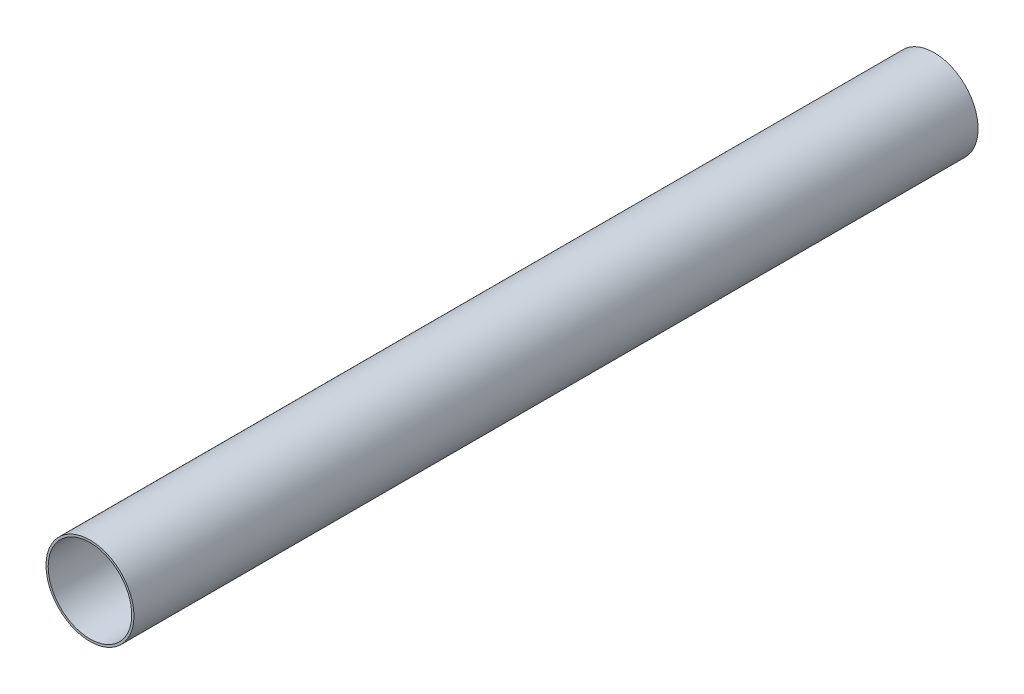
ISO-10303-21;
HEADER;
FILE_DESCRIPTION(('STEP AP214'),'2;1');
FILE_NAME('part.step','',(''),(''),'','','');
FILE_SCHEMA(('AUTOMOTIVE_DESIGN { 1 0 10303 214 1 1 1 1 }'));
ENDSEC;
DATA;
#1=APPLICATION_CONTEXT('core data for automotive mechanical design processes');
#2=APPLICATION_PROTOCOL_DEFINITION('international standard','automotive_design',2000,#1);
#3=PRODUCT_CONTEXT('',#1,'mechanical');
#4=PRODUCT('Part','Part','',(#3));
#5=PRODUCT_RELATED_PRODUCT_CATEGORY('part','',(#4));
#6=PRODUCT_DEFINITION_FORMATION('','',#4);
#7=PRODUCT_DEFINITION_CONTEXT('part definition',#1,'design');
#8=PRODUCT_DEFINITION('design','',#6,#7);
#9=PRODUCT_DEFINITION_SHAPE('','',#8);
#10=(LENGTH_UNIT() NAMED_UNIT(*) SI_UNIT(.MILLI.,.METRE.));
#11=(NAMED_UNIT(*) PLANE_ANGLE_UNIT() SI_UNIT($,.RADIAN.));
#12=(NAMED_UNIT(*) SI_UNIT($,.STERADIAN.) SOLID_ANGLE_UNIT());
#13=UNCERTAINTY_MEASURE_WITH_UNIT(LENGTH_MEASURE(1.E-05),#10,'distance_accuracy_value','');
#14=(GEOMETRIC_REPRESENTATION_CONTEXT(3) GLOBAL_UNCERTAINTY_ASSIGNED_CONTEXT((#13)) GLOBAL_UNIT_ASSIGNED_CONTEXT((#10,
#11,#12)) REPRESENTATION_CONTEXT('',''));
#15=CARTESIAN_POINT('',(0.,0.,0.));
#16=DIRECTION('',(0.,0.,1.));
#17=DIRECTION('',(1.,0.,0.));
#18=AXIS2_PLACEMENT_3D('',#15,#16,#17);
#19=CARTESIAN_POINT('',(0.,0.,609.6));
#20=DIRECTION('',(0.,0.,1.));
#21=DIRECTION('',(1.,0.,0.));
#22=AXIS2_PLACEMENT_3D('',#19,#20,#21);
#23=PLANE('',#22);
#24=CARTESIAN_POINT('',(0.,0.,609.6));
#25=DIRECTION('',(0.,0.,1.));
#26=DIRECTION('',(1.,0.,0.));
#27=AXIS2_PLACEMENT_3D('',#24,#25,#26);
#28=CIRCLE('',#27,31.75);
#29=CARTESIAN_POINT('',(-31.75,0.,609.6));
#30=VERTEX_POINT('',#29);
#31=EDGE_CURVE('E10',#30,#30,#28,.T.);
#32=ORIENTED_EDGE('',*,*,#31,.T.);
#33=EDGE_LOOP('',(#32));
#34=FACE_BOUND('',#33,.T.);
#35=CARTESIAN_POINT('',(0.,0.,609.6));
#36=DIRECTION('',(0.,0.,1.));
#37=DIRECTION('',(1.,0.,0.));
#38=AXIS2_PLACEMENT_3D('',#35,#36,#37);
#39=CIRCLE('',#38,30.1625);
#40=CARTESIAN_POINT('',(-30.1625,0.,609.6));
#41=VERTEX_POINT('',#40);
#42=EDGE_CURVE('E44',#41,#41,#39,.T.);
#43=ORIENTED_EDGE('',*,*,#42,.F.);
#44=EDGE_LOOP('',(#43));
#45=FACE_BOUND('',#44,.T.);
#46=ADVANCED_FACE('F33',(#34,#45),#23,.T.);
#47=CARTESIAN_POINT('',(0.,0.,0.));
#48=DIRECTION('',(0.,0.,1.));
#49=DIRECTION('',(1.,0.,0.));
#50=AXIS2_PLACEMENT_3D('',#47,#48,#49);
#51=PLANE('',#50);
#52=CARTESIAN_POINT('',(0.,0.,0.));
#53=DIRECTION('',(0.,0.,1.));
#54=DIRECTION('',(1.,0.,0.));
#55=AXIS2_PLACEMENT_3D('',#52,#53,#54);
#56=CIRCLE('',#55,31.75);
#57=CARTESIAN_POINT('',(-31.75,0.,0.));
#58=VERTEX_POINT('',#57);
#59=EDGE_CURVE('E37',#58,#58,#56,.T.);
#60=ORIENTED_EDGE('',*,*,#59,.F.);
#61=EDGE_LOOP('',(#60));
#62=FACE_BOUND('',#61,.T.);
#63=CARTESIAN_POINT('',(0.,0.,0.));
#64=DIRECTION('',(0.,0.,1.));
#65=DIRECTION('',(1.,0.,0.));
#66=AXIS2_PLACEMENT_3D('',#63,#64,#65);
#67=CIRCLE('',#66,30.1625);
#68=CARTESIAN_POINT('',(-30.1625,0.,0.));
#69=VERTEX_POINT('',#68);
#70=EDGE_CURVE('E46',#69,#69,#67,.T.);
#71=ORIENTED_EDGE('',*,*,#70,.T.);
#72=EDGE_LOOP('',(#71));
#73=FACE_BOUND('',#72,.T.);
#74=ADVANCED_FACE('F56',(#62,#73),#51,.F.);
#75=CARTESIAN_POINT('',(0.,0.,609.6));
#76=DIRECTION('',(0.,0.,-1.));
#77=DIRECTION('',(-1.,0.,0.));
#78=AXIS2_PLACEMENT_3D('',#75,#76,#77);
#79=CYLINDRICAL_SURFACE('',#78,31.75);
#80=CARTESIAN_POINT('',(-31.75,0.,609.6));
#81=CARTESIAN_POINT('',(-31.75,0.,603.25));
#82=CARTESIAN_POINT('',(-31.75,0.,596.9));
#83=CARTESIAN_POINT('',(-31.75,0.,584.2));
#84=CARTESIAN_POINT('',(-31.75,0.,577.85));
#85=CARTESIAN_POINT('',(-31.75,0.,565.15));
#86=CARTESIAN_POINT('',(-31.75,0.,558.8));
#87=CARTESIAN_POINT('',(-31.75,0.,546.1));
#88=CARTESIAN_POINT('',(-31.75,0.,539.75));
#89=CARTESIAN_POINT('',(-31.75,0.,527.05));
#90=CARTESIAN_POINT('',(-31.75,0.,520.7));
#91=CARTESIAN_POINT('',(-31.75,0.,508.));
#92=CARTESIAN_POINT('',(-31.75,0.,501.65));
#93=CARTESIAN_POINT('',(-31.75,0.,488.95));
#94=CARTESIAN_POINT('',(-31.75,0.,482.6));
#95=CARTESIAN_POINT('',(-31.75,0.,469.9));
#96=CARTESIAN_POINT('',(-31.75,0.,463.55));
#97=CARTESIAN_POINT('',(-31.75,0.,450.85));
#98=CARTESIAN_POINT('',(-31.75,0.,444.5));
#99=CARTESIAN_POINT('',(-31.75,0.,431.8));
#100=CARTESIAN_POINT('',(-31.75,0.,425.45));
#101=CARTESIAN_POINT('',(-31.75,0.,412.75));
#102=CARTESIAN_POINT('',(-31.75,0.,406.4));
#103=CARTESIAN_POINT('',(-31.75,0.,393.7));
#104=CARTESIAN_POINT('',(-31.75,0.,387.35));
#105=CARTESIAN_POINT('',(-31.75,0.,374.65));
#106=CARTESIAN_POINT('',(-31.75,0.,368.3));
#107=CARTESIAN_POINT('',(-31.75,0.,355.6));
#108=CARTESIAN_POINT('',(-31.75,0.,349.25));
#109=CARTESIAN_POINT('',(-31.75,0.,336.55));
#110=CARTESIAN_POINT('',(-31.75,0.,330.2));
#111=CARTESIAN_POINT('',(-31.75,0.,317.5));
#112=CARTESIAN_POINT('',(-31.75,0.,311.15));
#113=CARTESIAN_POINT('',(-31.75,0.,298.45));
#114=CARTESIAN_POINT('',(-31.75,0.,292.1));
#115=CARTESIAN_POINT('',(-31.75,0.,279.4));
#116=CARTESIAN_POINT('',(-31.75,0.,273.05));
#117=CARTESIAN_POINT('',(-31.75,0.,260.35));
#118=CARTESIAN_POINT('',(-31.75,0.,254.));
#119=CARTESIAN_POINT('',(-31.75,0.,241.3));
#120=CARTESIAN_POINT('',(-31.75,0.,234.95));
#121=CARTESIAN_POINT('',(-31.75,0.,222.25));
#122=CARTESIAN_POINT('',(-31.75,0.,215.9));
#123=CARTESIAN_POINT('',(-31.75,0.,203.2));
#124=CARTESIAN_POINT('',(-31.75,0.,196.85));
#125=CARTESIAN_POINT('',(-31.75,0.,184.15));
#126=CARTESIAN_POINT('',(-31.75,0.,177.8));
#127=CARTESIAN_POINT('',(-31.75,0.,165.1));
#128=CARTESIAN_POINT('',(-31.75,0.,158.75));
#129=CARTESIAN_POINT('',(-31.75,0.,146.05));
#130=CARTESIAN_POINT('',(-31.75,0.,139.7));
#131=CARTESIAN_POINT('',(-31.75,0.,127.));
#132=CARTESIAN_POINT('',(-31.75,0.,120.65));
#133=CARTESIAN_POINT('',(-31.75,0.,107.95));
#134=CARTESIAN_POINT('',(-31.75,0.,101.6));
#135=CARTESIAN_POINT('',(-31.75,0.,88.9));
#136=CARTESIAN_POINT('',(-31.75,0.,82.5500000000001));
#137=CARTESIAN_POINT('',(-31.75,0.,69.85));
#138=CARTESIAN_POINT('',(-31.75,0.,63.5));
#139=CARTESIAN_POINT('',(-31.75,0.,50.8));
#140=CARTESIAN_POINT('',(-31.75,0.,44.45));
#141=CARTESIAN_POINT('',(-31.75,0.,31.75));
#142=CARTESIAN_POINT('',(-31.75,0.,25.4));
#143=CARTESIAN_POINT('',(-31.75,0.,12.7));
#144=CARTESIAN_POINT('',(-31.75,0.,6.35000000000001));
#145=CARTESIAN_POINT('',(-31.75,0.,0.));
#146=B_SPLINE_CURVE_WITH_KNOTS('',3,(#80,#81,#82,#83,#84,#85,#86,#87,#88,#89,#90,#91,#92,#93,
#94,#95,#96,#97,#98,#99,#100,#101,#102,#103,#104,#105,#106,#107,#108,#109,#110,#111,#112,#113,
#114,#115,#116,#117,#118,#119,#120,#121,#122,#123,#124,#125,#126,#127,#128,#129,#130,#131,#132,
#133,#134,#135,#136,#137,#138,#139,#140,#141,#142,#143,#144,#145),.UNSPECIFIED.,.F.,.F.,(4,2,2,
2,2,2,2,2,2,2,2,2,2,2,2,2,2,2,2,2,2,2,2,2,2,2,2,2,2,2,2,2,4),(0.,19.05,38.1,57.15,76.2,
95.2500000000001,114.3,133.35,152.4,171.45,190.5,209.55,228.6,247.65,266.7,285.75,304.8,323.85,
342.9,361.95,381.,400.05,419.1,438.15,457.2,476.25,495.3,514.35,533.4,552.45,571.5,590.55,
609.6),.UNSPECIFIED.);
#147=EDGE_CURVE('BSEAM35',#30,#58,#146,.T.);
#148=ORIENTED_EDGE('',*,*,#31,.F.);
#149=ORIENTED_EDGE('',*,*,#59,.T.);
#150=ORIENTED_EDGE('',*,*,#147,.T.);
#151=ORIENTED_EDGE('',*,*,#147,.F.);
#152=EDGE_LOOP('',(#148,#150,#149,#151));
#153=FACE_BOUND('',#152,.T.);
#154=ADVANCED_FACE('F35',(#153),#79,.T.);
#155=CARTESIAN_POINT('',(0.,0.,609.6));
#156=DIRECTION('',(0.,0.,-1.));
#157=DIRECTION('',(-1.,0.,0.));
#158=AXIS2_PLACEMENT_3D('',#155,#156,#157);
#159=CYLINDRICAL_SURFACE('',#158,30.1625);
#160=CARTESIAN_POINT('',(-30.1625,0.,609.6));
#161=CARTESIAN_POINT('',(-30.1625,0.,603.25));
#162=CARTESIAN_POINT('',(-30.1625,0.,596.9));
#163=CARTESIAN_POINT('',(-30.1625,0.,584.2));
#164=CARTESIAN_POINT('',(-30.1625,0.,577.85));
#165=CARTESIAN_POINT('',(-30.1625,0.,565.15));
#166=CARTESIAN_POINT('',(-30.1625,0.,558.8));
#167=CARTESIAN_POINT('',(-30.1625,0.,546.1));
#168=CARTESIAN_POINT('',(-30.1625,0.,539.75));
#169=CARTESIAN_POINT('',(-30.1625,0.,527.05));
#170=CARTESIAN_POINT('',(-30.1625,0.,520.7));
#171=CARTESIAN_POINT('',(-30.1625,0.,508.));
#172=CARTESIAN_POINT('',(-30.1625,0.,501.65));
#173=CARTESIAN_POINT('',(-30.1625,0.,488.95));
#174=CARTESIAN_POINT('',(-30.1625,0.,482.6));
#175=CARTESIAN_POINT('',(-30.1625,0.,469.9));
#176=CARTESIAN_POINT('',(-30.1625,0.,463.55));
#177=CARTESIAN_POINT('',(-30.1625,0.,450.85));
#178=CARTESIAN_POINT('',(-30.1625,0.,444.5));
#179=CARTESIAN_POINT('',(-30.1625,0.,431.8));
#180=CARTESIAN_POINT('',(-30.1625,0.,425.45));
#181=CARTESIAN_POINT('',(-30.1625,0.,412.75));
#182=CARTESIAN_POINT('',(-30.1625,0.,406.4));
#183=CARTESIAN_POINT('',(-30.1625,0.,393.7));
#184=CARTESIAN_POINT('',(-30.1625,0.,387.35));
#185=CARTESIAN_POINT('',(-30.1625,0.,374.65));
#186=CARTESIAN_POINT('',(-30.1625,0.,368.3));
#187=CARTESIAN_POINT('',(-30.1625,0.,355.6));
#188=CARTESIAN_POINT('',(-30.1625,0.,349.25));
#189=CARTESIAN_POINT('',(-30.1625,0.,336.55));
#190=CARTESIAN_POINT('',(-30.1625,0.,330.2));
#191=CARTESIAN_POINT('',(-30.1625,0.,317.5));
#192=CARTESIAN_POINT('',(-30.1625,0.,311.15));
#193=CARTESIAN_POINT('',(-30.1625,0.,298.45));
#194=CARTESIAN_POINT('',(-30.1625,0.,292.1));
#195=CARTESIAN_POINT('',(-30.1625,0.,279.4));
#196=CARTESIAN_POINT('',(-30.1625,0.,273.05));
#197=CARTESIAN_POINT('',(-30.1625,0.,260.35));
#198=CARTESIAN_POINT('',(-30.1625,0.,254.));
#199=CARTESIAN_POINT('',(-30.1625,0.,241.3));
#200=CARTESIAN_POINT('',(-30.1625,0.,234.95));
#201=CARTESIAN_POINT('',(-30.1625,0.,222.25));
#202=CARTESIAN_POINT('',(-30.1625,0.,215.9));
#203=CARTESIAN_POINT('',(-30.1625,0.,203.2));
#204=CARTESIAN_POINT('',(-30.1625,0.,196.85));
#205=CARTESIAN_POINT('',(-30.1625,0.,184.15));
#206=CARTESIAN_POINT('',(-30.1625,0.,177.8));
#207=CARTESIAN_POINT('',(-30.1625,0.,165.1));
#208=CARTESIAN_POINT('',(-30.1625,0.,158.75));
#209=CARTESIAN_POINT('',(-30.1625,0.,146.05));
#210=CARTESIAN_POINT('',(-30.1625,0.,139.7));
#211=CARTESIAN_POINT('',(-30.1625,0.,127.));
#212=CARTESIAN_POINT('',(-30.1625,0.,120.65));
#213=CARTESIAN_POINT('',(-30.1625,0.,107.95));
#214=CARTESIAN_POINT('',(-30.1625,0.,101.6));
#215=CARTESIAN_POINT('',(-30.1625,0.,88.9));
#216=CARTESIAN_POINT('',(-30.1625,0.,82.5500000000001));
#217=CARTESIAN_POINT('',(-30.1625,0.,69.85));
#218=CARTESIAN_POINT('',(-30.1625,0.,63.5));
#219=CARTESIAN_POINT('',(-30.1625,0.,50.8));
#220=CARTESIAN_POINT('',(-30.1625,0.,44.45));
#221=CARTESIAN_POINT('',(-30.1625,0.,31.75));
#222=CARTESIAN_POINT('',(-30.1625,0.,25.4));
#223=CARTESIAN_POINT('',(-30.1625,0.,12.7));
#224=CARTESIAN_POINT('',(-30.1625,0.,6.35000000000001));
#225=CARTESIAN_POINT('',(-30.1625,0.,0.));
#226=B_SPLINE_CURVE_WITH_KNOTS('',3,(#160,#161,#162,#163,#164,#165,#166,#167,#168,#169,#170,
#171,#172,#173,#174,#175,#176,#177,#178,#179,#180,#181,#182,#183,#184,#185,#186,#187,#188,#189,
#190,#191,#192,#193,#194,#195,#196,#197,#198,#199,#200,#201,#202,#203,#204,#205,#206,#207,#208,
#209,#210,#211,#212,#213,#214,#215,#216,#217,#218,#219,#220,#221,#222,#223,#224,#225),
.UNSPECIFIED.,.F.,.F.,(4,2,2,2,2,2,2,2,2,2,2,2,2,2,2,2,2,2,2,2,2,2,2,2,2,2,2,2,2,2,2,2,4),(0.,
19.05,38.1,57.15,76.2,95.2500000000001,114.3,133.35,152.4,171.45,190.5,209.55,228.6,247.65,
266.7,285.75,304.8,323.85,342.9,361.95,381.,400.05,419.1,438.15,457.2,476.25,495.3,514.35,533.4,
552.45,571.5,590.55,609.6),.UNSPECIFIED.);
#227=EDGE_CURVE('BSEAM52',#41,#69,#226,.T.);
#228=ORIENTED_EDGE('',*,*,#42,.T.);
#229=ORIENTED_EDGE('',*,*,#70,.F.);
#230=ORIENTED_EDGE('',*,*,#227,.T.);
#231=ORIENTED_EDGE('',*,*,#227,.F.);
#232=EDGE_LOOP('',(#228,#230,#229,#231));
#233=FACE_BOUND('',#232,.T.);
#234=ADVANCED_FACE('F52',(#233),#159,.F.);
#235=CLOSED_SHELL('',(#46,#74,#154,#234));
#236=MANIFOLD_SOLID_BREP('B2',#235);
#237=ADVANCED_BREP_SHAPE_REPRESENTATION('',(#18,#236),#14);
#238=SHAPE_DEFINITION_REPRESENTATION(#9,#237);
ENDSEC;
END-ISO-10303-21;
